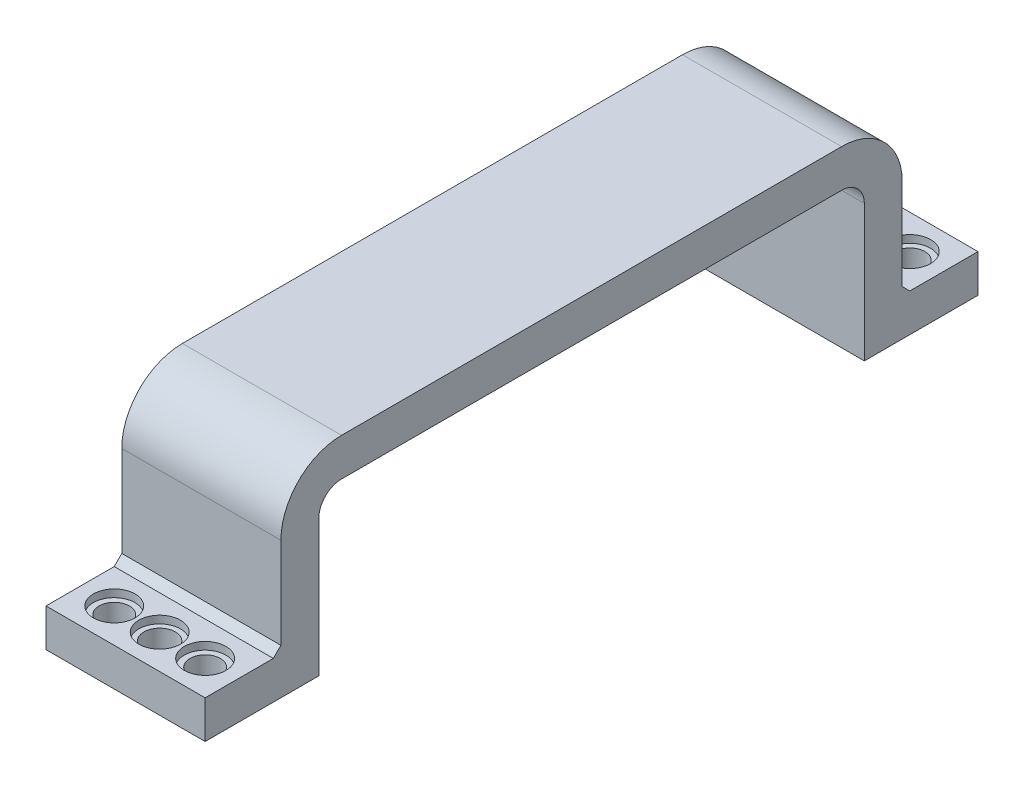
ISO-10303-21;
HEADER;
FILE_DESCRIPTION(('STEP AP214'),'2;1');
FILE_NAME('part.step','',(''),(''),'','','');
FILE_SCHEMA(('AUTOMOTIVE_DESIGN { 1 0 10303 214 1 1 1 1 }'));
ENDSEC;
DATA;
#1=APPLICATION_CONTEXT('core data for automotive mechanical design processes');
#2=APPLICATION_PROTOCOL_DEFINITION('international standard','automotive_design',2000,#1);
#3=PRODUCT_CONTEXT('',#1,'mechanical');
#4=PRODUCT('Part','Part','',(#3));
#5=PRODUCT_RELATED_PRODUCT_CATEGORY('part','',(#4));
#6=PRODUCT_DEFINITION_FORMATION('','',#4);
#7=PRODUCT_DEFINITION_CONTEXT('part definition',#1,'design');
#8=PRODUCT_DEFINITION('design','',#6,#7);
#9=PRODUCT_DEFINITION_SHAPE('','',#8);
#10=(LENGTH_UNIT() NAMED_UNIT(*) SI_UNIT(.MILLI.,.METRE.));
#11=(NAMED_UNIT(*) PLANE_ANGLE_UNIT() SI_UNIT($,.RADIAN.));
#12=(NAMED_UNIT(*) SI_UNIT($,.STERADIAN.) SOLID_ANGLE_UNIT());
#13=UNCERTAINTY_MEASURE_WITH_UNIT(LENGTH_MEASURE(1.E-05),#10,'distance_accuracy_value','');
#14=(GEOMETRIC_REPRESENTATION_CONTEXT(3) GLOBAL_UNCERTAINTY_ASSIGNED_CONTEXT((#13)) GLOBAL_UNIT_ASSIGNED_CONTEXT((#10,
#11,#12)) REPRESENTATION_CONTEXT('',''));
#15=CARTESIAN_POINT('',(0.,0.,0.));
#16=DIRECTION('',(0.,0.,1.));
#17=DIRECTION('',(1.,0.,0.));
#18=AXIS2_PLACEMENT_3D('',#15,#16,#17);
#19=CARTESIAN_POINT('',(21.,0.,51.));
#20=DIRECTION('',(0.,0.,-1.));
#21=DIRECTION('',(-1.,0.,0.));
#22=AXIS2_PLACEMENT_3D('',#19,#20,#21);
#23=PLANE('',#22);
#24=DIRECTION('',(0.,-1.,0.));
#25=VECTOR('',#24,1.);
#26=CARTESIAN_POINT('',(0.,0.,51.));
#27=LINE('',#26,#25);
#28=CARTESIAN_POINT('',(0.,5.,51.));
#29=VERTEX_POINT('',#28);
#30=CARTESIAN_POINT('',(0.,0.,51.));
#31=VERTEX_POINT('',#30);
#32=EDGE_CURVE('E204',#29,#31,#27,.T.);
#33=ORIENTED_EDGE('',*,*,#32,.T.);
#34=DIRECTION('',(-1.,0.,0.));
#35=VECTOR('',#34,1.);
#36=CARTESIAN_POINT('',(21.,0.,51.));
#37=LINE('',#36,#35);
#38=CARTESIAN_POINT('',(21.,0.,51.));
#39=VERTEX_POINT('',#38);
#40=EDGE_CURVE('E184',#39,#31,#37,.T.);
#41=ORIENTED_EDGE('',*,*,#40,.F.);
#42=DIRECTION('',(0.,-1.,0.));
#43=VECTOR('',#42,1.);
#44=CARTESIAN_POINT('',(21.,0.,51.));
#45=LINE('',#44,#43);
#46=CARTESIAN_POINT('',(21.,5.,51.));
#47=VERTEX_POINT('',#46);
#48=EDGE_CURVE('E258',#47,#39,#45,.T.);
#49=ORIENTED_EDGE('',*,*,#48,.F.);
#50=DIRECTION('',(-1.,0.,0.));
#51=VECTOR('',#50,1.);
#52=CARTESIAN_POINT('',(21.,5.,51.));
#53=LINE('',#52,#51);
#54=EDGE_CURVE('E207',#47,#29,#53,.T.);
#55=ORIENTED_EDGE('',*,*,#54,.T.);
#56=EDGE_LOOP('',(#33,#41,#49,#55));
#57=FACE_BOUND('',#56,.T.);
#58=ADVANCED_FACE('F45',(#57),#23,.F.);
#59=CARTESIAN_POINT('',(21.,0.,51.));
#60=DIRECTION('',(0.,1.,0.));
#61=DIRECTION('',(0.,0.,1.));
#62=AXIS2_PLACEMENT_3D('',#59,#60,#61);
#63=PLANE('',#62);
#64=CARTESIAN_POINT('',(4.5,0.,46.5));
#65=DIRECTION('',(0.,1.,0.));
#66=DIRECTION('',(0.,0.,1.));
#67=AXIS2_PLACEMENT_3D('',#64,#65,#66);
#68=CIRCLE('',#67,2.);
#69=CARTESIAN_POINT('',(4.5,0.,48.5));
#70=VERTEX_POINT('',#69);
#71=EDGE_CURVE('E286',#70,#70,#68,.T.);
#72=ORIENTED_EDGE('',*,*,#71,.T.);
#73=EDGE_LOOP('',(#72));
#74=FACE_BOUND('',#73,.T.);
#75=CARTESIAN_POINT('',(16.5,0.,46.5));
#76=DIRECTION('',(0.,1.,0.));
#77=DIRECTION('',(0.,0.,1.));
#78=AXIS2_PLACEMENT_3D('',#75,#76,#77);
#79=CIRCLE('',#78,2.);
#80=CARTESIAN_POINT('',(16.5,0.,48.5));
#81=VERTEX_POINT('',#80);
#82=EDGE_CURVE('E290',#81,#81,#79,.T.);
#83=ORIENTED_EDGE('',*,*,#82,.T.);
#84=EDGE_LOOP('',(#83));
#85=FACE_BOUND('',#84,.T.);
#86=CARTESIAN_POINT('',(10.5,0.,46.5));
#87=DIRECTION('',(0.,1.,0.));
#88=DIRECTION('',(0.,0.,1.));
#89=AXIS2_PLACEMENT_3D('',#86,#87,#88);
#90=CIRCLE('',#89,2.07032115171643);
#91=CARTESIAN_POINT('',(10.5,0.,48.5703211517164));
#92=VERTEX_POINT('',#91);
#93=EDGE_CURVE('E187',#92,#92,#90,.T.);
#94=ORIENTED_EDGE('',*,*,#93,.T.);
#95=EDGE_LOOP('',(#94));
#96=FACE_BOUND('',#95,.T.);
#97=DIRECTION('',(0.,0.,-1.));
#98=VECTOR('',#97,1.);
#99=CARTESIAN_POINT('',(0.,0.,51.));
#100=LINE('',#99,#98);
#101=CARTESIAN_POINT('',(0.,0.,36.));
#102=VERTEX_POINT('',#101);
#103=EDGE_CURVE('E63',#31,#102,#100,.T.);
#104=ORIENTED_EDGE('',*,*,#103,.T.);
#105=DIRECTION('',(-1.,0.,0.));
#106=VECTOR('',#105,1.);
#107=CARTESIAN_POINT('',(21.,0.,36.));
#108=LINE('',#107,#106);
#109=CARTESIAN_POINT('',(21.,0.,36.));
#110=VERTEX_POINT('',#109);
#111=EDGE_CURVE('E181',#110,#102,#108,.T.);
#112=ORIENTED_EDGE('',*,*,#111,.F.);
#113=DIRECTION('',(0.,0.,-1.));
#114=VECTOR('',#113,1.);
#115=CARTESIAN_POINT('',(21.,0.,51.));
#116=LINE('',#115,#114);
#117=EDGE_CURVE('E121',#39,#110,#116,.T.);
#118=ORIENTED_EDGE('',*,*,#117,.F.);
#119=ORIENTED_EDGE('',*,*,#40,.T.);
#120=EDGE_LOOP('',(#104,#112,#118,#119));
#121=FACE_BOUND('',#120,.T.);
#122=ADVANCED_FACE('F47',(#74,#85,#96,#121),#63,.F.);
#123=CARTESIAN_POINT('',(21.,0.,36.));
#124=DIRECTION('',(0.,0.,1.));
#125=DIRECTION('',(0.,-1.,0.));
#126=AXIS2_PLACEMENT_3D('',#123,#124,#125);
#127=PLANE('',#126);
#128=DIRECTION('',(0.,1.,0.));
#129=VECTOR('',#128,1.);
#130=CARTESIAN_POINT('',(0.,0.,36.));
#131=LINE('',#130,#129);
#132=CARTESIAN_POINT('',(0.,18.,36.));
#133=VERTEX_POINT('',#132);
#134=EDGE_CURVE('E178',#102,#133,#131,.T.);
#135=ORIENTED_EDGE('',*,*,#134,.T.);
#136=DIRECTION('',(-1.,0.,0.));
#137=VECTOR('',#136,1.);
#138=CARTESIAN_POINT('',(21.,18.,36.));
#139=LINE('',#138,#137);
#140=CARTESIAN_POINT('',(21.,18.,36.));
#141=VERTEX_POINT('',#140);
#142=EDGE_CURVE('E345',#141,#133,#139,.T.);
#143=ORIENTED_EDGE('',*,*,#142,.F.);
#144=DIRECTION('',(0.,1.,0.));
#145=VECTOR('',#144,1.);
#146=CARTESIAN_POINT('',(21.,0.,36.));
#147=LINE('',#146,#145);
#148=EDGE_CURVE('E190',#110,#141,#147,.T.);
#149=ORIENTED_EDGE('',*,*,#148,.F.);
#150=ORIENTED_EDGE('',*,*,#111,.T.);
#151=EDGE_LOOP('',(#135,#143,#149,#150));
#152=FACE_BOUND('',#151,.T.);
#153=ADVANCED_FACE('F189',(#152),#127,.F.);
#154=CARTESIAN_POINT('',(21.,18.,33.));
#155=DIRECTION('',(-1.,0.,0.));
#156=DIRECTION('',(0.,0.,1.));
#157=AXIS2_PLACEMENT_3D('',#154,#155,#156);
#158=CYLINDRICAL_SURFACE('',#157,3.);
#159=CARTESIAN_POINT('',(0.,18.,33.));
#160=DIRECTION('',(-1.,0.,0.));
#161=DIRECTION('',(0.,0.,1.));
#162=AXIS2_PLACEMENT_3D('',#159,#160,#161);
#163=CIRCLE('',#162,3.);
#164=CARTESIAN_POINT('',(0.,21.,33.));
#165=VERTEX_POINT('',#164);
#166=EDGE_CURVE('E192',#133,#165,#163,.T.);
#167=ORIENTED_EDGE('',*,*,#166,.T.);
#168=DIRECTION('',(-1.,0.,0.));
#169=VECTOR('',#168,1.);
#170=CARTESIAN_POINT('',(21.,21.,33.));
#171=LINE('',#170,#169);
#172=CARTESIAN_POINT('',(21.,21.,33.));
#173=VERTEX_POINT('',#172);
#174=EDGE_CURVE('E349',#173,#165,#171,.T.);
#175=ORIENTED_EDGE('',*,*,#174,.F.);
#176=CARTESIAN_POINT('',(21.,18.,33.));
#177=DIRECTION('',(-1.,0.,0.));
#178=DIRECTION('',(0.,0.,1.));
#179=AXIS2_PLACEMENT_3D('',#176,#177,#178);
#180=CIRCLE('',#179,3.);
#181=EDGE_CURVE('E251',#141,#173,#180,.T.);
#182=ORIENTED_EDGE('',*,*,#181,.F.);
#183=ORIENTED_EDGE('',*,*,#142,.T.);
#184=EDGE_LOOP('',(#167,#175,#182,#183));
#185=FACE_BOUND('',#184,.T.);
#186=ADVANCED_FACE('F472',(#185),#158,.F.);
#187=CARTESIAN_POINT('',(21.,21.,33.));
#188=DIRECTION('',(0.,1.,0.));
#189=DIRECTION('',(0.,0.,1.));
#190=AXIS2_PLACEMENT_3D('',#187,#188,#189);
#191=PLANE('',#190);
#192=DIRECTION('',(0.,0.,-1.));
#193=VECTOR('',#192,1.);
#194=CARTESIAN_POINT('',(0.,21.,33.));
#195=LINE('',#194,#193);
#196=CARTESIAN_POINT('',(0.,21.,-33.));
#197=VERTEX_POINT('',#196);
#198=EDGE_CURVE('E348',#165,#197,#195,.T.);
#199=ORIENTED_EDGE('',*,*,#198,.T.);
#200=DIRECTION('',(-1.,0.,0.));
#201=VECTOR('',#200,1.);
#202=CARTESIAN_POINT('',(21.,21.,-33.));
#203=LINE('',#202,#201);
#204=CARTESIAN_POINT('',(21.,21.,-33.));
#205=VERTEX_POINT('',#204);
#206=EDGE_CURVE('E354',#205,#197,#203,.T.);
#207=ORIENTED_EDGE('',*,*,#206,.F.);
#208=DIRECTION('',(0.,0.,-1.));
#209=VECTOR('',#208,1.);
#210=CARTESIAN_POINT('',(21.,21.,33.));
#211=LINE('',#210,#209);
#212=EDGE_CURVE('E248',#173,#205,#211,.T.);
#213=ORIENTED_EDGE('',*,*,#212,.F.);
#214=ORIENTED_EDGE('',*,*,#174,.T.);
#215=EDGE_LOOP('',(#199,#207,#213,#214));
#216=FACE_BOUND('',#215,.T.);
#217=ADVANCED_FACE('F448',(#216),#191,.F.);
#218=CARTESIAN_POINT('',(21.,18.,-33.));
#219=DIRECTION('',(-1.,0.,0.));
#220=DIRECTION('',(0.,0.,1.));
#221=AXIS2_PLACEMENT_3D('',#218,#219,#220);
#222=CYLINDRICAL_SURFACE('',#221,3.);
#223=CARTESIAN_POINT('',(0.,18.,-33.));
#224=DIRECTION('',(-1.,0.,0.));
#225=DIRECTION('',(0.,0.,-1.));
#226=AXIS2_PLACEMENT_3D('',#223,#224,#225);
#227=CIRCLE('',#226,3.);
#228=CARTESIAN_POINT('',(0.,18.,-36.));
#229=VERTEX_POINT('',#228);
#230=EDGE_CURVE('E353',#197,#229,#227,.T.);
#231=ORIENTED_EDGE('',*,*,#230,.T.);
#232=DIRECTION('',(-1.,0.,0.));
#233=VECTOR('',#232,1.);
#234=CARTESIAN_POINT('',(21.,18.,-36.));
#235=LINE('',#234,#233);
#236=CARTESIAN_POINT('',(21.,18.,-36.));
#237=VERTEX_POINT('',#236);
#238=EDGE_CURVE('E359',#237,#229,#235,.T.);
#239=ORIENTED_EDGE('',*,*,#238,.F.);
#240=CARTESIAN_POINT('',(21.,18.,-33.));
#241=DIRECTION('',(-1.,0.,0.));
#242=DIRECTION('',(0.,0.,-1.));
#243=AXIS2_PLACEMENT_3D('',#240,#241,#242);
#244=CIRCLE('',#243,3.);
#245=EDGE_CURVE('E245',#205,#237,#244,.T.);
#246=ORIENTED_EDGE('',*,*,#245,.F.);
#247=ORIENTED_EDGE('',*,*,#206,.T.);
#248=EDGE_LOOP('',(#231,#239,#246,#247));
#249=FACE_BOUND('',#248,.T.);
#250=ADVANCED_FACE('F454',(#249),#222,.F.);
#251=CARTESIAN_POINT('',(21.,0.,-36.));
#252=DIRECTION('',(0.,0.,-1.));
#253=DIRECTION('',(0.,1.,0.));
#254=AXIS2_PLACEMENT_3D('',#251,#252,#253);
#255=PLANE('',#254);
#256=DIRECTION('',(0.,-1.,0.));
#257=VECTOR('',#256,1.);
#258=CARTESIAN_POINT('',(0.,0.,-36.));
#259=LINE('',#258,#257);
#260=CARTESIAN_POINT('',(0.,0.,-36.));
#261=VERTEX_POINT('',#260);
#262=EDGE_CURVE('E358',#229,#261,#259,.T.);
#263=ORIENTED_EDGE('',*,*,#262,.T.);
#264=DIRECTION('',(-1.,0.,0.));
#265=VECTOR('',#264,1.);
#266=CARTESIAN_POINT('',(21.,0.,-36.));
#267=LINE('',#266,#265);
#268=CARTESIAN_POINT('',(21.,0.,-36.));
#269=VERTEX_POINT('',#268);
#270=EDGE_CURVE('E364',#269,#261,#267,.T.);
#271=ORIENTED_EDGE('',*,*,#270,.F.);
#272=DIRECTION('',(0.,-1.,0.));
#273=VECTOR('',#272,1.);
#274=CARTESIAN_POINT('',(21.,0.,-36.));
#275=LINE('',#274,#273);
#276=EDGE_CURVE('E242',#237,#269,#275,.T.);
#277=ORIENTED_EDGE('',*,*,#276,.F.);
#278=ORIENTED_EDGE('',*,*,#238,.T.);
#279=EDGE_LOOP('',(#263,#271,#277,#278));
#280=FACE_BOUND('',#279,.T.);
#281=ADVANCED_FACE('F461',(#280),#255,.F.);
#282=CARTESIAN_POINT('',(21.,0.,-51.));
#283=DIRECTION('',(0.,1.,0.));
#284=DIRECTION('',(0.,0.,1.));
#285=AXIS2_PLACEMENT_3D('',#282,#283,#284);
#286=PLANE('',#285);
#287=CARTESIAN_POINT('',(16.5,0.,-46.5));
#288=DIRECTION('',(0.,1.,0.));
#289=DIRECTION('',(0.,0.,1.));
#290=AXIS2_PLACEMENT_3D('',#287,#288,#289);
#291=CIRCLE('',#290,2.);
#292=CARTESIAN_POINT('',(16.5,0.,-44.5));
#293=VERTEX_POINT('',#292);
#294=EDGE_CURVE('E363',#293,#293,#291,.T.);
#295=ORIENTED_EDGE('',*,*,#294,.T.);
#296=EDGE_LOOP('',(#295));
#297=FACE_BOUND('',#296,.T.);
#298=CARTESIAN_POINT('',(10.5,0.,-46.5));
#299=DIRECTION('',(0.,1.,0.));
#300=DIRECTION('',(0.,0.,1.));
#301=AXIS2_PLACEMENT_3D('',#298,#299,#300);
#302=CIRCLE('',#301,2.);
#303=CARTESIAN_POINT('',(10.5,0.,-44.5));
#304=VERTEX_POINT('',#303);
#305=EDGE_CURVE('E873',#304,#304,#302,.T.);
#306=ORIENTED_EDGE('',*,*,#305,.T.);
#307=EDGE_LOOP('',(#306));
#308=FACE_BOUND('',#307,.T.);
#309=CARTESIAN_POINT('',(4.5,0.,-46.5));
#310=DIRECTION('',(0.,1.,0.));
#311=DIRECTION('',(0.,0.,1.));
#312=AXIS2_PLACEMENT_3D('',#309,#310,#311);
#313=CIRCLE('',#312,2.);
#314=CARTESIAN_POINT('',(4.5,0.,-44.5));
#315=VERTEX_POINT('',#314);
#316=EDGE_CURVE('E441',#315,#315,#313,.T.);
#317=ORIENTED_EDGE('',*,*,#316,.T.);
#318=EDGE_LOOP('',(#317));
#319=FACE_BOUND('',#318,.T.);
#320=DIRECTION('',(0.,0.,-1.));
#321=VECTOR('',#320,1.);
#322=CARTESIAN_POINT('',(0.,0.,-51.));
#323=LINE('',#322,#321);
#324=CARTESIAN_POINT('',(0.,0.,-51.));
#325=VERTEX_POINT('',#324);
#326=EDGE_CURVE('E369',#261,#325,#323,.T.);
#327=ORIENTED_EDGE('',*,*,#326,.T.);
#328=DIRECTION('',(-1.,0.,0.));
#329=VECTOR('',#328,1.);
#330=CARTESIAN_POINT('',(21.,0.,-51.));
#331=LINE('',#330,#329);
#332=CARTESIAN_POINT('',(21.,0.,-51.));
#333=VERTEX_POINT('',#332);
#334=EDGE_CURVE('E370',#333,#325,#331,.T.);
#335=ORIENTED_EDGE('',*,*,#334,.F.);
#336=DIRECTION('',(0.,0.,-1.));
#337=VECTOR('',#336,1.);
#338=CARTESIAN_POINT('',(21.,0.,-51.));
#339=LINE('',#338,#337);
#340=EDGE_CURVE('E239',#269,#333,#339,.T.);
#341=ORIENTED_EDGE('',*,*,#340,.F.);
#342=ORIENTED_EDGE('',*,*,#270,.T.);
#343=EDGE_LOOP('',(#327,#335,#341,#342));
#344=FACE_BOUND('',#343,.T.);
#345=ADVANCED_FACE('F465',(#297,#308,#319,#344),#286,.F.);
#346=CARTESIAN_POINT('',(21.,0.,-51.));
#347=DIRECTION('',(0.,0.,1.));
#348=DIRECTION('',(0.,-1.,0.));
#349=AXIS2_PLACEMENT_3D('',#346,#347,#348);
#350=PLANE('',#349);
#351=DIRECTION('',(0.,1.,0.));
#352=VECTOR('',#351,1.);
#353=CARTESIAN_POINT('',(0.,0.,-51.));
#354=LINE('',#353,#352);
#355=CARTESIAN_POINT('',(0.,5.00000000000001,-51.));
#356=VERTEX_POINT('',#355);
#357=EDGE_CURVE('E368',#325,#356,#354,.T.);
#358=ORIENTED_EDGE('',*,*,#357,.T.);
#359=DIRECTION('',(-1.,0.,0.));
#360=VECTOR('',#359,1.);
#361=CARTESIAN_POINT('',(21.,5.00000000000001,-51.));
#362=LINE('',#361,#360);
#363=CARTESIAN_POINT('',(21.,5.00000000000001,-51.));
#364=VERTEX_POINT('',#363);
#365=EDGE_CURVE('E375',#364,#356,#362,.T.);
#366=ORIENTED_EDGE('',*,*,#365,.F.);
#367=DIRECTION('',(0.,1.,0.));
#368=VECTOR('',#367,1.);
#369=CARTESIAN_POINT('',(21.,0.,-51.));
#370=LINE('',#369,#368);
#371=EDGE_CURVE('E236',#333,#364,#370,.T.);
#372=ORIENTED_EDGE('',*,*,#371,.F.);
#373=ORIENTED_EDGE('',*,*,#334,.T.);
#374=EDGE_LOOP('',(#358,#366,#372,#373));
#375=FACE_BOUND('',#374,.T.);
#376=ADVANCED_FACE('F533',(#375),#350,.F.);
#377=CARTESIAN_POINT('',(21.,5.00000000000001,-51.));
#378=DIRECTION('',(0.,-1.,0.));
#379=DIRECTION('',(0.,0.,-1.));
#380=AXIS2_PLACEMENT_3D('',#377,#378,#379);
#381=PLANE('',#380);
#382=CARTESIAN_POINT('',(16.5,5.00000000000001,-46.5));
#383=DIRECTION('',(0.,-1.,0.));
#384=DIRECTION('',(0.,0.,-1.));
#385=AXIS2_PLACEMENT_3D('',#382,#383,#384);
#386=CIRCLE('',#385,2.75);
#387=CARTESIAN_POINT('',(16.5,5.00000000000001,-49.25));
#388=VERTEX_POINT('',#387);
#389=EDGE_CURVE('E374',#388,#388,#386,.T.);
#390=ORIENTED_EDGE('',*,*,#389,.T.);
#391=EDGE_LOOP('',(#390));
#392=FACE_BOUND('',#391,.T.);
#393=CARTESIAN_POINT('',(4.5,5.00000000000001,-46.5));
#394=DIRECTION('',(0.,-1.,0.));
#395=DIRECTION('',(0.,0.,-1.));
#396=AXIS2_PLACEMENT_3D('',#393,#394,#395);
#397=CIRCLE('',#396,2.75);
#398=CARTESIAN_POINT('',(4.5,5.00000000000001,-49.25));
#399=VERTEX_POINT('',#398);
#400=EDGE_CURVE('E887',#399,#399,#397,.T.);
#401=ORIENTED_EDGE('',*,*,#400,.T.);
#402=EDGE_LOOP('',(#401));
#403=FACE_BOUND('',#402,.T.);
#404=CARTESIAN_POINT('',(10.5,5.00000000000001,-46.5));
#405=DIRECTION('',(0.,-1.,0.));
#406=DIRECTION('',(0.,0.,-1.));
#407=AXIS2_PLACEMENT_3D('',#404,#405,#406);
#408=CIRCLE('',#407,2.75);
#409=CARTESIAN_POINT('',(10.5,5.00000000000001,-49.25));
#410=VERTEX_POINT('',#409);
#411=EDGE_CURVE('E436',#410,#410,#408,.T.);
#412=ORIENTED_EDGE('',*,*,#411,.T.);
#413=EDGE_LOOP('',(#412));
#414=FACE_BOUND('',#413,.T.);
#415=DIRECTION('',(0.,0.,1.));
#416=VECTOR('',#415,1.);
#417=CARTESIAN_POINT('',(0.,5.00000000000001,-51.));
#418=LINE('',#417,#416);
#419=CARTESIAN_POINT('',(0.,5.,-42.));
#420=VERTEX_POINT('',#419);
#421=EDGE_CURVE('E380',#356,#420,#418,.T.);
#422=ORIENTED_EDGE('',*,*,#421,.T.);
#423=DIRECTION('',(-1.,0.,0.));
#424=VECTOR('',#423,1.);
#425=CARTESIAN_POINT('',(21.,5.,-42.));
#426=LINE('',#425,#424);
#427=CARTESIAN_POINT('',(21.,5.,-42.));
#428=VERTEX_POINT('',#427);
#429=EDGE_CURVE('E381',#428,#420,#426,.T.);
#430=ORIENTED_EDGE('',*,*,#429,.F.);
#431=DIRECTION('',(0.,0.,1.));
#432=VECTOR('',#431,1.);
#433=CARTESIAN_POINT('',(21.,5.00000000000001,-51.));
#434=LINE('',#433,#432);
#435=EDGE_CURVE('E233',#364,#428,#434,.T.);
#436=ORIENTED_EDGE('',*,*,#435,.F.);
#437=ORIENTED_EDGE('',*,*,#365,.T.);
#438=EDGE_LOOP('',(#422,#430,#436,#437));
#439=FACE_BOUND('',#438,.T.);
#440=ADVANCED_FACE('F531',(#392,#403,#414,#439),#381,.F.);
#441=CARTESIAN_POINT('',(21.,5.,-42.));
#442=DIRECTION('',(0.,-0.707106781186543,0.707106781186551));
#443=DIRECTION('',(0.,-0.707106781186551,-0.707106781186544));
#444=AXIS2_PLACEMENT_3D('',#441,#442,#443);
#445=PLANE('',#444);
#446=DIRECTION('',(0.,0.707106781186551,0.707106781186543));
#447=VECTOR('',#446,1.);
#448=CARTESIAN_POINT('',(0.,5.,-42.));
#449=LINE('',#448,#447);
#450=CARTESIAN_POINT('',(0.,6.00000000000001,-41.));
#451=VERTEX_POINT('',#450);
#452=EDGE_CURVE('E379',#420,#451,#449,.T.);
#453=ORIENTED_EDGE('',*,*,#452,.T.);
#454=DIRECTION('',(-1.,0.,0.));
#455=VECTOR('',#454,1.);
#456=CARTESIAN_POINT('',(21.,6.00000000000001,-41.));
#457=LINE('',#456,#455);
#458=CARTESIAN_POINT('',(21.,6.00000000000001,-41.));
#459=VERTEX_POINT('',#458);
#460=EDGE_CURVE('E386',#459,#451,#457,.T.);
#461=ORIENTED_EDGE('',*,*,#460,.F.);
#462=DIRECTION('',(0.,0.707106781186551,0.707106781186543));
#463=VECTOR('',#462,1.);
#464=CARTESIAN_POINT('',(21.,5.,-42.));
#465=LINE('',#464,#463);
#466=EDGE_CURVE('E230',#428,#459,#465,.T.);
#467=ORIENTED_EDGE('',*,*,#466,.F.);
#468=ORIENTED_EDGE('',*,*,#429,.T.);
#469=EDGE_LOOP('',(#453,#461,#467,#468));
#470=FACE_BOUND('',#469,.T.);
#471=ADVANCED_FACE('F526',(#470),#445,.F.);
#472=CARTESIAN_POINT('',(21.,6.00000000000001,-41.));
#473=DIRECTION('',(0.,0.,1.));
#474=DIRECTION('',(0.,-1.,0.));
#475=AXIS2_PLACEMENT_3D('',#472,#473,#474);
#476=PLANE('',#475);
#477=DIRECTION('',(0.,1.,0.));
#478=VECTOR('',#477,1.);
#479=CARTESIAN_POINT('',(0.,6.00000000000001,-41.));
#480=LINE('',#479,#478);
#481=CARTESIAN_POINT('',(0.,18.,-41.));
#482=VERTEX_POINT('',#481);
#483=EDGE_CURVE('E385',#451,#482,#480,.T.);
#484=ORIENTED_EDGE('',*,*,#483,.T.);
#485=DIRECTION('',(-1.,0.,0.));
#486=VECTOR('',#485,1.);
#487=CARTESIAN_POINT('',(21.,18.,-41.));
#488=LINE('',#487,#486);
#489=CARTESIAN_POINT('',(21.,18.,-41.));
#490=VERTEX_POINT('',#489);
#491=EDGE_CURVE('E391',#490,#482,#488,.T.);
#492=ORIENTED_EDGE('',*,*,#491,.F.);
#493=DIRECTION('',(0.,1.,0.));
#494=VECTOR('',#493,1.);
#495=CARTESIAN_POINT('',(21.,6.00000000000001,-41.));
#496=LINE('',#495,#494);
#497=EDGE_CURVE('E227',#459,#490,#496,.T.);
#498=ORIENTED_EDGE('',*,*,#497,.F.);
#499=ORIENTED_EDGE('',*,*,#460,.T.);
#500=EDGE_LOOP('',(#484,#492,#498,#499));
#501=FACE_BOUND('',#500,.T.);
#502=ADVANCED_FACE('F521',(#501),#476,.F.);
#503=CARTESIAN_POINT('',(21.,18.,-33.));
#504=DIRECTION('',(-1.,0.,0.));
#505=DIRECTION('',(0.,0.,1.));
#506=AXIS2_PLACEMENT_3D('',#503,#504,#505);
#507=CYLINDRICAL_SURFACE('',#506,8.);
#508=CARTESIAN_POINT('',(0.,18.,-33.));
#509=DIRECTION('',(1.,0.,0.));
#510=DIRECTION('',(0.,0.,-1.));
#511=AXIS2_PLACEMENT_3D('',#508,#509,#510);
#512=CIRCLE('',#511,8.);
#513=CARTESIAN_POINT('',(0.,26.,-33.));
#514=VERTEX_POINT('',#513);
#515=EDGE_CURVE('E390',#482,#514,#512,.T.);
#516=ORIENTED_EDGE('',*,*,#515,.T.);
#517=DIRECTION('',(-1.,0.,0.));
#518=VECTOR('',#517,1.);
#519=CARTESIAN_POINT('',(21.,26.,-33.));
#520=LINE('',#519,#518);
#521=CARTESIAN_POINT('',(21.,26.,-33.));
#522=VERTEX_POINT('',#521);
#523=EDGE_CURVE('E396',#522,#514,#520,.T.);
#524=ORIENTED_EDGE('',*,*,#523,.F.);
#525=CARTESIAN_POINT('',(21.,18.,-33.));
#526=DIRECTION('',(1.,0.,0.));
#527=DIRECTION('',(0.,0.,-1.));
#528=AXIS2_PLACEMENT_3D('',#525,#526,#527);
#529=CIRCLE('',#528,8.);
#530=EDGE_CURVE('E224',#490,#522,#529,.T.);
#531=ORIENTED_EDGE('',*,*,#530,.F.);
#532=ORIENTED_EDGE('',*,*,#491,.T.);
#533=EDGE_LOOP('',(#516,#524,#531,#532));
#534=FACE_BOUND('',#533,.T.);
#535=ADVANCED_FACE('F517',(#534),#507,.T.);
#536=CARTESIAN_POINT('',(21.,26.,33.));
#537=DIRECTION('',(0.,-1.,0.));
#538=DIRECTION('',(0.,0.,-1.));
#539=AXIS2_PLACEMENT_3D('',#536,#537,#538);
#540=PLANE('',#539);
#541=DIRECTION('',(0.,0.,1.));
#542=VECTOR('',#541,1.);
#543=CARTESIAN_POINT('',(0.,26.,33.));
#544=LINE('',#543,#542);
#545=CARTESIAN_POINT('',(0.,26.,33.));
#546=VERTEX_POINT('',#545);
#547=EDGE_CURVE('E395',#514,#546,#544,.T.);
#548=ORIENTED_EDGE('',*,*,#547,.T.);
#549=DIRECTION('',(-1.,0.,0.));
#550=VECTOR('',#549,1.);
#551=CARTESIAN_POINT('',(21.,26.,33.));
#552=LINE('',#551,#550);
#553=CARTESIAN_POINT('',(21.,26.,33.));
#554=VERTEX_POINT('',#553);
#555=EDGE_CURVE('E401',#554,#546,#552,.T.);
#556=ORIENTED_EDGE('',*,*,#555,.F.);
#557=DIRECTION('',(0.,0.,1.));
#558=VECTOR('',#557,1.);
#559=CARTESIAN_POINT('',(21.,26.,33.));
#560=LINE('',#559,#558);
#561=EDGE_CURVE('E221',#522,#554,#560,.T.);
#562=ORIENTED_EDGE('',*,*,#561,.F.);
#563=ORIENTED_EDGE('',*,*,#523,.T.);
#564=EDGE_LOOP('',(#548,#556,#562,#563));
#565=FACE_BOUND('',#564,.T.);
#566=ADVANCED_FACE('F512',(#565),#540,.F.);
#567=CARTESIAN_POINT('',(21.,18.,33.));
#568=DIRECTION('',(-1.,0.,0.));
#569=DIRECTION('',(0.,0.,1.));
#570=AXIS2_PLACEMENT_3D('',#567,#568,#569);
#571=CYLINDRICAL_SURFACE('',#570,8.);
#572=CARTESIAN_POINT('',(0.,18.,33.));
#573=DIRECTION('',(1.,0.,0.));
#574=DIRECTION('',(0.,0.,1.));
#575=AXIS2_PLACEMENT_3D('',#572,#573,#574);
#576=CIRCLE('',#575,8.);
#577=CARTESIAN_POINT('',(0.,18.,41.));
#578=VERTEX_POINT('',#577);
#579=EDGE_CURVE('E400',#546,#578,#576,.T.);
#580=ORIENTED_EDGE('',*,*,#579,.T.);
#581=DIRECTION('',(-1.,0.,0.));
#582=VECTOR('',#581,1.);
#583=CARTESIAN_POINT('',(21.,18.,41.));
#584=LINE('',#583,#582);
#585=CARTESIAN_POINT('',(21.,18.,41.));
#586=VERTEX_POINT('',#585);
#587=EDGE_CURVE('E406',#586,#578,#584,.T.);
#588=ORIENTED_EDGE('',*,*,#587,.F.);
#589=CARTESIAN_POINT('',(21.,18.,33.));
#590=DIRECTION('',(1.,0.,0.));
#591=DIRECTION('',(0.,0.,1.));
#592=AXIS2_PLACEMENT_3D('',#589,#590,#591);
#593=CIRCLE('',#592,8.);
#594=EDGE_CURVE('E218',#554,#586,#593,.T.);
#595=ORIENTED_EDGE('',*,*,#594,.F.);
#596=ORIENTED_EDGE('',*,*,#555,.T.);
#597=EDGE_LOOP('',(#580,#588,#595,#596));
#598=FACE_BOUND('',#597,.T.);
#599=ADVANCED_FACE('F506',(#598),#571,.T.);
#600=CARTESIAN_POINT('',(21.,6.,41.));
#601=DIRECTION('',(0.,0.,-1.));
#602=DIRECTION('',(0.,1.,0.));
#603=AXIS2_PLACEMENT_3D('',#600,#601,#602);
#604=PLANE('',#603);
#605=DIRECTION('',(0.,-1.,0.));
#606=VECTOR('',#605,1.);
#607=CARTESIAN_POINT('',(0.,6.,41.));
#608=LINE('',#607,#606);
#609=CARTESIAN_POINT('',(0.,6.,41.));
#610=VERTEX_POINT('',#609);
#611=EDGE_CURVE('E405',#578,#610,#608,.T.);
#612=ORIENTED_EDGE('',*,*,#611,.T.);
#613=DIRECTION('',(-1.,0.,0.));
#614=VECTOR('',#613,1.);
#615=CARTESIAN_POINT('',(21.,6.,41.));
#616=LINE('',#615,#614);
#617=CARTESIAN_POINT('',(21.,6.,41.));
#618=VERTEX_POINT('',#617);
#619=EDGE_CURVE('E341',#618,#610,#616,.T.);
#620=ORIENTED_EDGE('',*,*,#619,.F.);
#621=DIRECTION('',(0.,-1.,0.));
#622=VECTOR('',#621,1.);
#623=CARTESIAN_POINT('',(21.,6.,41.));
#624=LINE('',#623,#622);
#625=EDGE_CURVE('E215',#586,#618,#624,.T.);
#626=ORIENTED_EDGE('',*,*,#625,.F.);
#627=ORIENTED_EDGE('',*,*,#587,.T.);
#628=EDGE_LOOP('',(#612,#620,#626,#627));
#629=FACE_BOUND('',#628,.T.);
#630=ADVANCED_FACE('F504',(#629),#604,.F.);
#631=CARTESIAN_POINT('',(21.,5.,42.));
#632=DIRECTION('',(0.,-0.707106781186548,-0.707106781186547));
#633=DIRECTION('',(0.,0.707106781186547,-0.707106781186548));
#634=AXIS2_PLACEMENT_3D('',#631,#632,#633);
#635=PLANE('',#634);
#636=DIRECTION('',(0.,-0.707106781186547,0.707106781186548));
#637=VECTOR('',#636,1.);
#638=CARTESIAN_POINT('',(0.,5.,42.));
#639=LINE('',#638,#637);
#640=CARTESIAN_POINT('',(0.,5.,42.));
#641=VERTEX_POINT('',#640);
#642=EDGE_CURVE('E410',#610,#641,#639,.T.);
#643=ORIENTED_EDGE('',*,*,#642,.T.);
#644=DIRECTION('',(-1.,0.,0.));
#645=VECTOR('',#644,1.);
#646=CARTESIAN_POINT('',(21.,5.,42.));
#647=LINE('',#646,#645);
#648=CARTESIAN_POINT('',(21.,5.,42.));
#649=VERTEX_POINT('',#648);
#650=EDGE_CURVE('E261',#649,#641,#647,.T.);
#651=ORIENTED_EDGE('',*,*,#650,.F.);
#652=DIRECTION('',(0.,-0.707106781186547,0.707106781186548));
#653=VECTOR('',#652,1.);
#654=CARTESIAN_POINT('',(21.,5.,42.));
#655=LINE('',#654,#653);
#656=EDGE_CURVE('E212',#618,#649,#655,.T.);
#657=ORIENTED_EDGE('',*,*,#656,.F.);
#658=ORIENTED_EDGE('',*,*,#619,.T.);
#659=EDGE_LOOP('',(#643,#651,#657,#658));
#660=FACE_BOUND('',#659,.T.);
#661=ADVANCED_FACE('F495',(#660),#635,.F.);
#662=CARTESIAN_POINT('',(21.,5.,51.));
#663=DIRECTION('',(0.,-1.,0.));
#664=DIRECTION('',(0.,0.,-1.));
#665=AXIS2_PLACEMENT_3D('',#662,#663,#664);
#666=PLANE('',#665);
#667=CARTESIAN_POINT('',(16.5,5.,46.5));
#668=DIRECTION('',(0.,-1.,0.));
#669=DIRECTION('',(0.,0.,-1.));
#670=AXIS2_PLACEMENT_3D('',#667,#668,#669);
#671=CIRCLE('',#670,2.75);
#672=CARTESIAN_POINT('',(16.5,5.,43.75));
#673=VERTEX_POINT('',#672);
#674=EDGE_CURVE('E334',#673,#673,#671,.T.);
#675=ORIENTED_EDGE('',*,*,#674,.T.);
#676=EDGE_LOOP('',(#675));
#677=FACE_BOUND('',#676,.T.);
#678=CARTESIAN_POINT('',(10.5,5.,46.5));
#679=DIRECTION('',(0.,-1.,0.));
#680=DIRECTION('',(0.,0.,-1.));
#681=AXIS2_PLACEMENT_3D('',#678,#679,#680);
#682=CIRCLE('',#681,2.75);
#683=CARTESIAN_POINT('',(10.5,5.,43.75));
#684=VERTEX_POINT('',#683);
#685=EDGE_CURVE('E330',#684,#684,#682,.T.);
#686=ORIENTED_EDGE('',*,*,#685,.T.);
#687=EDGE_LOOP('',(#686));
#688=FACE_BOUND('',#687,.T.);
#689=CARTESIAN_POINT('',(4.5,5.,46.5));
#690=DIRECTION('',(0.,-1.,0.));
#691=DIRECTION('',(0.,0.,-1.));
#692=AXIS2_PLACEMENT_3D('',#689,#690,#691);
#693=CIRCLE('',#692,2.75);
#694=CARTESIAN_POINT('',(4.5,5.,43.75));
#695=VERTEX_POINT('',#694);
#696=EDGE_CURVE('E333',#695,#695,#693,.T.);
#697=ORIENTED_EDGE('',*,*,#696,.T.);
#698=EDGE_LOOP('',(#697));
#699=FACE_BOUND('',#698,.T.);
#700=DIRECTION('',(0.,0.,1.));
#701=VECTOR('',#700,1.);
#702=CARTESIAN_POINT('',(0.,5.,51.));
#703=LINE('',#702,#701);
#704=EDGE_CURVE('E130',#641,#29,#703,.T.);
#705=ORIENTED_EDGE('',*,*,#704,.T.);
#706=ORIENTED_EDGE('',*,*,#54,.F.);
#707=DIRECTION('',(0.,0.,1.));
#708=VECTOR('',#707,1.);
#709=CARTESIAN_POINT('',(21.,5.,51.));
#710=LINE('',#709,#708);
#711=EDGE_CURVE('E208',#649,#47,#710,.T.);
#712=ORIENTED_EDGE('',*,*,#711,.F.);
#713=ORIENTED_EDGE('',*,*,#650,.T.);
#714=EDGE_LOOP('',(#705,#706,#712,#713));
#715=FACE_BOUND('',#714,.T.);
#716=ADVANCED_FACE('F499',(#677,#688,#699,#715),#666,.F.);
#717=CARTESIAN_POINT('',(21.,18.,33.));
#718=DIRECTION('',(-1.,0.,0.));
#719=DIRECTION('',(0.,0.,1.));
#720=AXIS2_PLACEMENT_3D('',#717,#718,#719);
#721=PLANE('',#720);
#722=ORIENTED_EDGE('',*,*,#48,.T.);
#723=ORIENTED_EDGE('',*,*,#117,.T.);
#724=ORIENTED_EDGE('',*,*,#148,.T.);
#725=ORIENTED_EDGE('',*,*,#181,.T.);
#726=ORIENTED_EDGE('',*,*,#212,.T.);
#727=ORIENTED_EDGE('',*,*,#245,.T.);
#728=ORIENTED_EDGE('',*,*,#276,.T.);
#729=ORIENTED_EDGE('',*,*,#340,.T.);
#730=ORIENTED_EDGE('',*,*,#371,.T.);
#731=ORIENTED_EDGE('',*,*,#435,.T.);
#732=ORIENTED_EDGE('',*,*,#466,.T.);
#733=ORIENTED_EDGE('',*,*,#497,.T.);
#734=ORIENTED_EDGE('',*,*,#530,.T.);
#735=ORIENTED_EDGE('',*,*,#561,.T.);
#736=ORIENTED_EDGE('',*,*,#594,.T.);
#737=ORIENTED_EDGE('',*,*,#625,.T.);
#738=ORIENTED_EDGE('',*,*,#656,.T.);
#739=ORIENTED_EDGE('',*,*,#711,.T.);
#740=EDGE_LOOP('',(#722,#723,#724,#725,#726,#727,#728,#729,#730,#731,#732,#733,#734,#735,#736,
#737,#738,#739));
#741=FACE_BOUND('',#740,.T.);
#742=ADVANCED_FACE('F468',(#741),#721,.F.);
#743=CARTESIAN_POINT('',(0.,18.,33.));
#744=DIRECTION('',(-1.,0.,0.));
#745=DIRECTION('',(0.,0.,1.));
#746=AXIS2_PLACEMENT_3D('',#743,#744,#745);
#747=PLANE('',#746);
#748=ORIENTED_EDGE('',*,*,#32,.F.);
#749=ORIENTED_EDGE('',*,*,#704,.F.);
#750=ORIENTED_EDGE('',*,*,#642,.F.);
#751=ORIENTED_EDGE('',*,*,#611,.F.);
#752=ORIENTED_EDGE('',*,*,#579,.F.);
#753=ORIENTED_EDGE('',*,*,#547,.F.);
#754=ORIENTED_EDGE('',*,*,#515,.F.);
#755=ORIENTED_EDGE('',*,*,#483,.F.);
#756=ORIENTED_EDGE('',*,*,#452,.F.);
#757=ORIENTED_EDGE('',*,*,#421,.F.);
#758=ORIENTED_EDGE('',*,*,#357,.F.);
#759=ORIENTED_EDGE('',*,*,#326,.F.);
#760=ORIENTED_EDGE('',*,*,#262,.F.);
#761=ORIENTED_EDGE('',*,*,#230,.F.);
#762=ORIENTED_EDGE('',*,*,#198,.F.);
#763=ORIENTED_EDGE('',*,*,#166,.F.);
#764=ORIENTED_EDGE('',*,*,#134,.F.);
#765=ORIENTED_EDGE('',*,*,#103,.F.);
#766=EDGE_LOOP('',(#748,#749,#750,#751,#752,#753,#754,#755,#756,#757,#758,#759,#760,#761,#762,
#763,#764,#765));
#767=FACE_BOUND('',#766,.T.);
#768=ADVANCED_FACE('F195',(#767),#747,.T.);
#769=CARTESIAN_POINT('',(4.5,4.,46.5));
#770=DIRECTION('',(0.,1.,0.));
#771=DIRECTION('',(0.,0.,1.));
#772=AXIS2_PLACEMENT_3D('',#769,#770,#771);
#773=CYLINDRICAL_SURFACE('',#772,2.75);
#774=CARTESIAN_POINT('',(4.5,4.,46.5));
#775=DIRECTION('',(0.,1.,0.));
#776=DIRECTION('',(0.,0.,-1.));
#777=AXIS2_PLACEMENT_3D('',#774,#775,#776);
#778=CIRCLE('',#777,2.75);
#779=CARTESIAN_POINT('',(4.5,4.,43.75));
#780=VERTEX_POINT('',#779);
#781=EDGE_CURVE('E211',#780,#780,#778,.T.);
#782=ORIENTED_EDGE('',*,*,#781,.F.);
#783=EDGE_LOOP('',(#782));
#784=FACE_BOUND('',#783,.T.);
#785=ORIENTED_EDGE('',*,*,#696,.F.);
#786=EDGE_LOOP('',(#785));
#787=FACE_BOUND('',#786,.T.);
#788=ADVANCED_FACE('F565',(#784,#787),#773,.F.);
#789=CARTESIAN_POINT('',(4.5,4.,46.5));
#790=DIRECTION('',(0.,-1.,0.));
#791=DIRECTION('',(0.,0.,-1.));
#792=AXIS2_PLACEMENT_3D('',#789,#790,#791);
#793=PLANE('',#792);
#794=CARTESIAN_POINT('',(4.5,4.,46.5));
#795=DIRECTION('',(0.,1.,0.));
#796=DIRECTION('',(0.,0.,-1.));
#797=AXIS2_PLACEMENT_3D('',#794,#795,#796);
#798=CIRCLE('',#797,2.);
#799=CARTESIAN_POINT('',(4.5,4.,44.5));
#800=VERTEX_POINT('',#799);
#801=EDGE_CURVE('E301',#800,#800,#798,.T.);
#802=ORIENTED_EDGE('',*,*,#801,.F.);
#803=EDGE_LOOP('',(#802));
#804=FACE_BOUND('',#803,.T.);
#805=ORIENTED_EDGE('',*,*,#781,.T.);
#806=EDGE_LOOP('',(#805));
#807=FACE_BOUND('',#806,.T.);
#808=ADVANCED_FACE('F326',(#804,#807),#793,.F.);
#809=CARTESIAN_POINT('',(10.5,4.,46.5));
#810=DIRECTION('',(0.,1.,0.));
#811=DIRECTION('',(0.,0.,1.));
#812=AXIS2_PLACEMENT_3D('',#809,#810,#811);
#813=CYLINDRICAL_SURFACE('',#812,2.75);
#814=CARTESIAN_POINT('',(10.5,4.,46.5));
#815=DIRECTION('',(0.,1.,0.));
#816=DIRECTION('',(0.,0.,-1.));
#817=AXIS2_PLACEMENT_3D('',#814,#815,#816);
#818=CIRCLE('',#817,2.75);
#819=CARTESIAN_POINT('',(10.5,4.,43.75));
#820=VERTEX_POINT('',#819);
#821=EDGE_CURVE('E268',#820,#820,#818,.T.);
#822=ORIENTED_EDGE('',*,*,#821,.F.);
#823=EDGE_LOOP('',(#822));
#824=FACE_BOUND('',#823,.T.);
#825=ORIENTED_EDGE('',*,*,#685,.F.);
#826=EDGE_LOOP('',(#825));
#827=FACE_BOUND('',#826,.T.);
#828=ADVANCED_FACE('F320',(#824,#827),#813,.F.);
#829=CARTESIAN_POINT('',(10.5,4.,46.5));
#830=DIRECTION('',(0.,-1.,0.));
#831=DIRECTION('',(0.,0.,-1.));
#832=AXIS2_PLACEMENT_3D('',#829,#830,#831);
#833=PLANE('',#832);
#834=CARTESIAN_POINT('',(10.5,4.,46.5));
#835=DIRECTION('',(0.,1.,0.));
#836=DIRECTION('',(0.,0.,1.));
#837=AXIS2_PLACEMENT_3D('',#834,#835,#836);
#838=CIRCLE('',#837,2.07032115171643);
#839=CARTESIAN_POINT('',(10.5,4.,48.5703211517164));
#840=VERTEX_POINT('',#839);
#841=EDGE_CURVE('E305',#840,#840,#838,.T.);
#842=ORIENTED_EDGE('',*,*,#841,.F.);
#843=EDGE_LOOP('',(#842));
#844=FACE_BOUND('',#843,.T.);
#845=ORIENTED_EDGE('',*,*,#821,.T.);
#846=EDGE_LOOP('',(#845));
#847=FACE_BOUND('',#846,.T.);
#848=ADVANCED_FACE('F316',(#844,#847),#833,.F.);
#849=CARTESIAN_POINT('',(16.5,4.,46.5));
#850=DIRECTION('',(0.,1.,0.));
#851=DIRECTION('',(0.,0.,1.));
#852=AXIS2_PLACEMENT_3D('',#849,#850,#851);
#853=CYLINDRICAL_SURFACE('',#852,2.75);
#854=CARTESIAN_POINT('',(16.5,4.,46.5));
#855=DIRECTION('',(0.,1.,0.));
#856=DIRECTION('',(0.,0.,-1.));
#857=AXIS2_PLACEMENT_3D('',#854,#855,#856);
#858=CIRCLE('',#857,2.75);
#859=CARTESIAN_POINT('',(16.5,4.,43.75));
#860=VERTEX_POINT('',#859);
#861=EDGE_CURVE('E267',#860,#860,#858,.T.);
#862=ORIENTED_EDGE('',*,*,#861,.F.);
#863=EDGE_LOOP('',(#862));
#864=FACE_BOUND('',#863,.T.);
#865=ORIENTED_EDGE('',*,*,#674,.F.);
#866=EDGE_LOOP('',(#865));
#867=FACE_BOUND('',#866,.T.);
#868=ADVANCED_FACE('F319',(#864,#867),#853,.F.);
#869=CARTESIAN_POINT('',(16.5,4.,46.5));
#870=DIRECTION('',(0.,-1.,0.));
#871=DIRECTION('',(0.,0.,-1.));
#872=AXIS2_PLACEMENT_3D('',#869,#870,#871);
#873=PLANE('',#872);
#874=CARTESIAN_POINT('',(16.5,4.,46.5));
#875=DIRECTION('',(0.,1.,0.));
#876=DIRECTION('',(0.,0.,-1.));
#877=AXIS2_PLACEMENT_3D('',#874,#875,#876);
#878=CIRCLE('',#877,2.);
#879=CARTESIAN_POINT('',(16.5,4.,44.5));
#880=VERTEX_POINT('',#879);
#881=EDGE_CURVE('E282',#880,#880,#878,.T.);
#882=ORIENTED_EDGE('',*,*,#881,.F.);
#883=EDGE_LOOP('',(#882));
#884=FACE_BOUND('',#883,.T.);
#885=ORIENTED_EDGE('',*,*,#861,.T.);
#886=EDGE_LOOP('',(#885));
#887=FACE_BOUND('',#886,.T.);
#888=ADVANCED_FACE('F572',(#884,#887),#873,.F.);
#889=CARTESIAN_POINT('',(10.5,4.00000000000001,-46.5));
#890=DIRECTION('',(0.,1.,0.));
#891=DIRECTION('',(0.,0.,1.));
#892=AXIS2_PLACEMENT_3D('',#889,#890,#891);
#893=CYLINDRICAL_SURFACE('',#892,2.75);
#894=CARTESIAN_POINT('',(10.5,4.00000000000001,-46.5));
#895=DIRECTION('',(0.,1.,0.));
#896=DIRECTION('',(0.,0.,1.));
#897=AXIS2_PLACEMENT_3D('',#894,#895,#896);
#898=CIRCLE('',#897,2.75);
#899=CARTESIAN_POINT('',(10.5,4.00000000000001,-43.75));
#900=VERTEX_POINT('',#899);
#901=EDGE_CURVE('E262',#900,#900,#898,.T.);
#902=ORIENTED_EDGE('',*,*,#901,.F.);
#903=EDGE_LOOP('',(#902));
#904=FACE_BOUND('',#903,.T.);
#905=ORIENTED_EDGE('',*,*,#411,.F.);
#906=EDGE_LOOP('',(#905));
#907=FACE_BOUND('',#906,.T.);
#908=ADVANCED_FACE('F568',(#904,#907),#893,.F.);
#909=CARTESIAN_POINT('',(10.5,4.00000000000001,-46.5));
#910=DIRECTION('',(0.,1.,0.));
#911=DIRECTION('',(0.,0.,1.));
#912=AXIS2_PLACEMENT_3D('',#909,#910,#911);
#913=PLANE('',#912);
#914=CARTESIAN_POINT('',(10.5,4.00000000000001,-46.5));
#915=DIRECTION('',(0.,1.,0.));
#916=DIRECTION('',(0.,0.,1.));
#917=AXIS2_PLACEMENT_3D('',#914,#915,#916);
#918=CIRCLE('',#917,2.);
#919=CARTESIAN_POINT('',(10.5,4.00000000000001,-44.5));
#920=VERTEX_POINT('',#919);
#921=EDGE_CURVE('E49',#920,#920,#918,.T.);
#922=ORIENTED_EDGE('',*,*,#921,.F.);
#923=EDGE_LOOP('',(#922));
#924=FACE_BOUND('',#923,.T.);
#925=ORIENTED_EDGE('',*,*,#901,.T.);
#926=EDGE_LOOP('',(#925));
#927=FACE_BOUND('',#926,.T.);
#928=ADVANCED_FACE('F571',(#924,#927),#913,.T.);
#929=CARTESIAN_POINT('',(4.5,4.00000000000001,-46.5));
#930=DIRECTION('',(0.,1.,0.));
#931=DIRECTION('',(0.,0.,1.));
#932=AXIS2_PLACEMENT_3D('',#929,#930,#931);
#933=CYLINDRICAL_SURFACE('',#932,2.75);
#934=CARTESIAN_POINT('',(4.5,4.00000000000001,-46.5));
#935=DIRECTION('',(0.,1.,0.));
#936=DIRECTION('',(0.,0.,1.));
#937=AXIS2_PLACEMENT_3D('',#934,#935,#936);
#938=CIRCLE('',#937,2.75);
#939=CARTESIAN_POINT('',(4.5,4.00000000000001,-43.75));
#940=VERTEX_POINT('',#939);
#941=EDGE_CURVE('E266',#940,#940,#938,.T.);
#942=ORIENTED_EDGE('',*,*,#941,.F.);
#943=EDGE_LOOP('',(#942));
#944=FACE_BOUND('',#943,.T.);
#945=ORIENTED_EDGE('',*,*,#400,.F.);
#946=EDGE_LOOP('',(#945));
#947=FACE_BOUND('',#946,.T.);
#948=ADVANCED_FACE('F575',(#944,#947),#933,.F.);
#949=CARTESIAN_POINT('',(4.5,4.00000000000001,-46.5));
#950=DIRECTION('',(0.,1.,0.));
#951=DIRECTION('',(0.,0.,1.));
#952=AXIS2_PLACEMENT_3D('',#949,#950,#951);
#953=PLANE('',#952);
#954=CARTESIAN_POINT('',(4.5,4.00000000000001,-46.5));
#955=DIRECTION('',(0.,1.,0.));
#956=DIRECTION('',(0.,0.,1.));
#957=AXIS2_PLACEMENT_3D('',#954,#955,#956);
#958=CIRCLE('',#957,2.);
#959=CARTESIAN_POINT('',(4.5,4.00000000000001,-44.5));
#960=VERTEX_POINT('',#959);
#961=EDGE_CURVE('E297',#960,#960,#958,.T.);
#962=ORIENTED_EDGE('',*,*,#961,.F.);
#963=EDGE_LOOP('',(#962));
#964=FACE_BOUND('',#963,.T.);
#965=ORIENTED_EDGE('',*,*,#941,.T.);
#966=EDGE_LOOP('',(#965));
#967=FACE_BOUND('',#966,.T.);
#968=ADVANCED_FACE('F581',(#964,#967),#953,.T.);
#969=CARTESIAN_POINT('',(16.5,4.00000000000001,-46.5));
#970=DIRECTION('',(0.,1.,0.));
#971=DIRECTION('',(0.,0.,1.));
#972=AXIS2_PLACEMENT_3D('',#969,#970,#971);
#973=CYLINDRICAL_SURFACE('',#972,2.75);
#974=CARTESIAN_POINT('',(16.5,4.00000000000001,-46.5));
#975=DIRECTION('',(0.,1.,0.));
#976=DIRECTION('',(0.,0.,1.));
#977=AXIS2_PLACEMENT_3D('',#974,#975,#976);
#978=CIRCLE('',#977,2.75);
#979=CARTESIAN_POINT('',(16.5,4.00000000000001,-43.75));
#980=VERTEX_POINT('',#979);
#981=EDGE_CURVE('E278',#980,#980,#978,.T.);
#982=ORIENTED_EDGE('',*,*,#981,.F.);
#983=EDGE_LOOP('',(#982));
#984=FACE_BOUND('',#983,.T.);
#985=ORIENTED_EDGE('',*,*,#389,.F.);
#986=EDGE_LOOP('',(#985));
#987=FACE_BOUND('',#986,.T.);
#988=ADVANCED_FACE('F584',(#984,#987),#973,.F.);
#989=CARTESIAN_POINT('',(16.5,4.00000000000001,-46.5));
#990=DIRECTION('',(0.,1.,0.));
#991=DIRECTION('',(0.,0.,1.));
#992=AXIS2_PLACEMENT_3D('',#989,#990,#991);
#993=PLANE('',#992);
#994=CARTESIAN_POINT('',(16.5,4.00000000000001,-46.5));
#995=DIRECTION('',(0.,1.,0.));
#996=DIRECTION('',(0.,0.,1.));
#997=AXIS2_PLACEMENT_3D('',#994,#995,#996);
#998=CIRCLE('',#997,2.);
#999=CARTESIAN_POINT('',(16.5,4.00000000000001,-44.5));
#1000=VERTEX_POINT('',#999);
#1001=EDGE_CURVE('E11',#1000,#1000,#998,.T.);
#1002=ORIENTED_EDGE('',*,*,#1001,.F.);
#1003=EDGE_LOOP('',(#1002));
#1004=FACE_BOUND('',#1003,.T.);
#1005=ORIENTED_EDGE('',*,*,#981,.T.);
#1006=EDGE_LOOP('',(#1005));
#1007=FACE_BOUND('',#1006,.T.);
#1008=ADVANCED_FACE('F589',(#1004,#1007),#993,.T.);
#1009=CARTESIAN_POINT('',(16.5,-18.,46.5));
#1010=DIRECTION('',(0.,1.,0.));
#1011=DIRECTION('',(0.,0.,1.));
#1012=AXIS2_PLACEMENT_3D('',#1009,#1010,#1011);
#1013=CYLINDRICAL_SURFACE('',#1012,2.);
#1014=ORIENTED_EDGE('',*,*,#881,.T.);
#1015=EDGE_LOOP('',(#1014));
#1016=FACE_BOUND('',#1015,.T.);
#1017=ORIENTED_EDGE('',*,*,#82,.F.);
#1018=EDGE_LOOP('',(#1017));
#1019=FACE_BOUND('',#1018,.T.);
#1020=ADVANCED_FACE('F592',(#1016,#1019),#1013,.F.);
#1021=CARTESIAN_POINT('',(10.5,-18.,46.5));
#1022=DIRECTION('',(0.,1.,0.));
#1023=DIRECTION('',(0.,0.,1.));
#1024=AXIS2_PLACEMENT_3D('',#1021,#1022,#1023);
#1025=CYLINDRICAL_SURFACE('',#1024,2.07032115171643);
#1026=ORIENTED_EDGE('',*,*,#841,.T.);
#1027=EDGE_LOOP('',(#1026));
#1028=FACE_BOUND('',#1027,.T.);
#1029=ORIENTED_EDGE('',*,*,#93,.F.);
#1030=EDGE_LOOP('',(#1029));
#1031=FACE_BOUND('',#1030,.T.);
#1032=ADVANCED_FACE('F313',(#1028,#1031),#1025,.F.);
#1033=CARTESIAN_POINT('',(4.5,-18.,46.5));
#1034=DIRECTION('',(0.,1.,0.));
#1035=DIRECTION('',(0.,0.,1.));
#1036=AXIS2_PLACEMENT_3D('',#1033,#1034,#1035);
#1037=CYLINDRICAL_SURFACE('',#1036,2.);
#1038=ORIENTED_EDGE('',*,*,#801,.T.);
#1039=EDGE_LOOP('',(#1038));
#1040=FACE_BOUND('',#1039,.T.);
#1041=ORIENTED_EDGE('',*,*,#71,.F.);
#1042=EDGE_LOOP('',(#1041));
#1043=FACE_BOUND('',#1042,.T.);
#1044=ADVANCED_FACE('F604',(#1040,#1043),#1037,.F.);
#1045=CARTESIAN_POINT('',(4.5,-18.,-46.5));
#1046=DIRECTION('',(0.,1.,0.));
#1047=DIRECTION('',(0.,0.,1.));
#1048=AXIS2_PLACEMENT_3D('',#1045,#1046,#1047);
#1049=CYLINDRICAL_SURFACE('',#1048,2.);
#1050=ORIENTED_EDGE('',*,*,#961,.T.);
#1051=EDGE_LOOP('',(#1050));
#1052=FACE_BOUND('',#1051,.T.);
#1053=ORIENTED_EDGE('',*,*,#316,.F.);
#1054=EDGE_LOOP('',(#1053));
#1055=FACE_BOUND('',#1054,.T.);
#1056=ADVANCED_FACE('F600',(#1052,#1055),#1049,.F.);
#1057=CARTESIAN_POINT('',(10.5,-18.,-46.5));
#1058=DIRECTION('',(0.,1.,0.));
#1059=DIRECTION('',(0.,0.,1.));
#1060=AXIS2_PLACEMENT_3D('',#1057,#1058,#1059);
#1061=CYLINDRICAL_SURFACE('',#1060,2.);
#1062=ORIENTED_EDGE('',*,*,#921,.T.);
#1063=EDGE_LOOP('',(#1062));
#1064=FACE_BOUND('',#1063,.T.);
#1065=ORIENTED_EDGE('',*,*,#305,.F.);
#1066=EDGE_LOOP('',(#1065));
#1067=FACE_BOUND('',#1066,.T.);
#1068=ADVANCED_FACE('F603',(#1064,#1067),#1061,.F.);
#1069=CARTESIAN_POINT('',(16.5,-18.,-46.5));
#1070=DIRECTION('',(0.,1.,0.));
#1071=DIRECTION('',(0.,0.,1.));
#1072=AXIS2_PLACEMENT_3D('',#1069,#1070,#1071);
#1073=CYLINDRICAL_SURFACE('',#1072,2.);
#1074=ORIENTED_EDGE('',*,*,#1001,.T.);
#1075=EDGE_LOOP('',(#1074));
#1076=FACE_BOUND('',#1075,.T.);
#1077=ORIENTED_EDGE('',*,*,#294,.F.);
#1078=EDGE_LOOP('',(#1077));
#1079=FACE_BOUND('',#1078,.T.);
#1080=ADVANCED_FACE('F614',(#1076,#1079),#1073,.F.);
#1081=CLOSED_SHELL('',(#58,#122,#153,#186,#217,#250,#281,#345,#376,#440,#471,#502,#535,#566,
#599,#630,#661,#716,#742,#768,#788,#808,#828,#848,#868,#888,#908,#928,#948,#968,#988,#1008,
#1020,#1032,#1044,#1056,#1068,#1080));
#1082=MANIFOLD_SOLID_BREP('B2',#1081);
#1083=ADVANCED_BREP_SHAPE_REPRESENTATION('',(#18,#1082),#14);
#1084=SHAPE_DEFINITION_REPRESENTATION(#9,#1083);
ENDSEC;
END-ISO-10303-21;
